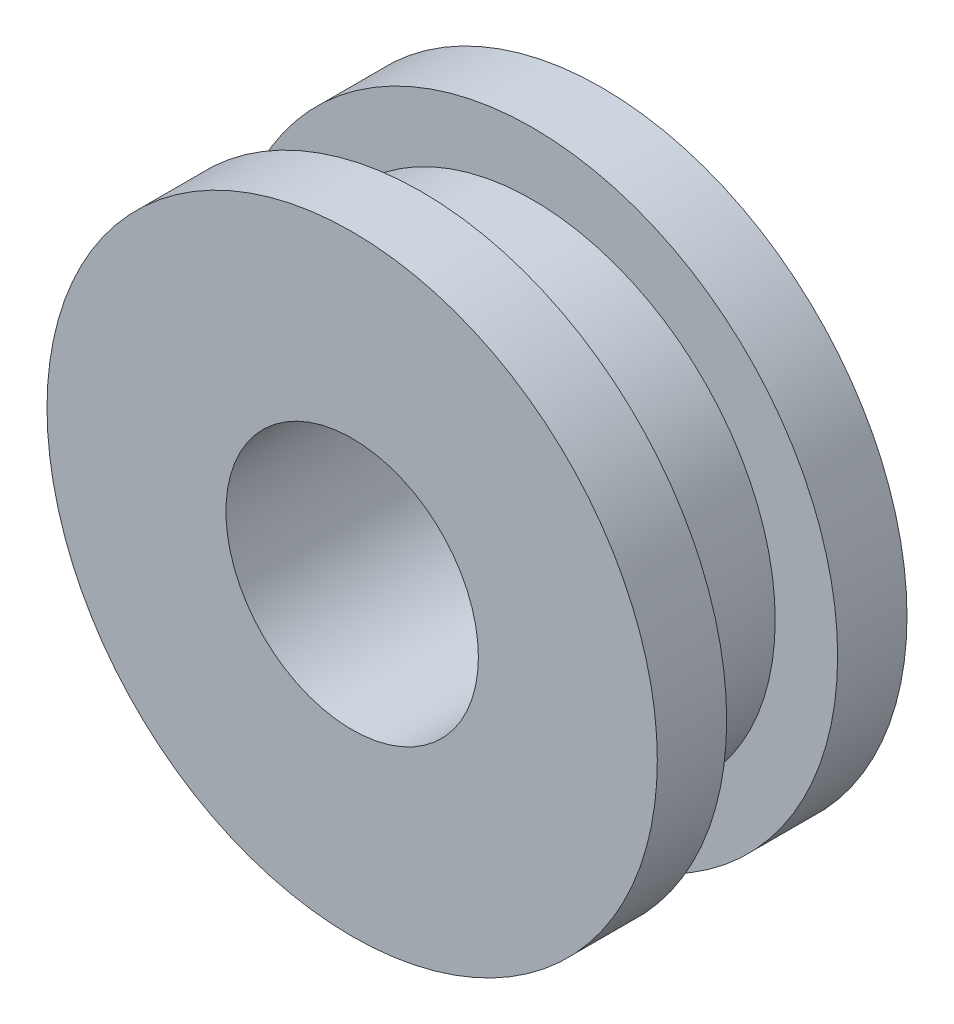
ISO-10303-21;
HEADER;
FILE_DESCRIPTION(('STEP AP214'),'2;1');
FILE_NAME('part.step','',(''),(''),'','','');
FILE_SCHEMA(('AUTOMOTIVE_DESIGN { 1 0 10303 214 1 1 1 1 }'));
ENDSEC;
DATA;
#1=APPLICATION_CONTEXT('core data for automotive mechanical design processes');
#2=APPLICATION_PROTOCOL_DEFINITION('international standard','automotive_design',2000,#1);
#3=PRODUCT_CONTEXT('',#1,'mechanical');
#4=PRODUCT('Part','Part','',(#3));
#5=PRODUCT_RELATED_PRODUCT_CATEGORY('part','',(#4));
#6=PRODUCT_DEFINITION_FORMATION('','',#4);
#7=PRODUCT_DEFINITION_CONTEXT('part definition',#1,'design');
#8=PRODUCT_DEFINITION('design','',#6,#7);
#9=PRODUCT_DEFINITION_SHAPE('','',#8);
#10=(LENGTH_UNIT() NAMED_UNIT(*) SI_UNIT(.MILLI.,.METRE.));
#11=(NAMED_UNIT(*) PLANE_ANGLE_UNIT() SI_UNIT($,.RADIAN.));
#12=(NAMED_UNIT(*) SI_UNIT($,.STERADIAN.) SOLID_ANGLE_UNIT());
#13=UNCERTAINTY_MEASURE_WITH_UNIT(LENGTH_MEASURE(1.E-05),#10,'distance_accuracy_value','');
#14=(GEOMETRIC_REPRESENTATION_CONTEXT(3) GLOBAL_UNCERTAINTY_ASSIGNED_CONTEXT((#13)) GLOBAL_UNIT_ASSIGNED_CONTEXT((#10,
#11,#12)) REPRESENTATION_CONTEXT('',''));
#15=CARTESIAN_POINT('',(0.,0.,0.));
#16=DIRECTION('',(0.,0.,1.));
#17=DIRECTION('',(1.,0.,0.));
#18=AXIS2_PLACEMENT_3D('',#15,#16,#17);
#19=CARTESIAN_POINT('',(0.,4.55,4.5));
#20=DIRECTION('',(0.,0.,-1.));
#21=DIRECTION('',(-1.,0.,0.));
#22=AXIS2_PLACEMENT_3D('',#19,#20,#21);
#23=PLANE('',#22);
#24=CARTESIAN_POINT('',(0.,0.,4.5));
#25=DIRECTION('',(0.,0.,1.));
#26=DIRECTION('',(1.,0.,0.));
#27=AXIS2_PLACEMENT_3D('',#24,#25,#26);
#28=CIRCLE('',#27,4.55);
#29=CARTESIAN_POINT('',(4.55,0.,4.5));
#30=VERTEX_POINT('',#29);
#31=EDGE_CURVE('E72',#30,#30,#28,.T.);
#32=ORIENTED_EDGE('',*,*,#31,.F.);
#33=EDGE_LOOP('',(#32));
#34=FACE_BOUND('',#33,.T.);
#35=CARTESIAN_POINT('',(0.,0.,4.5));
#36=DIRECTION('',(0.,0.,1.));
#37=DIRECTION('',(1.,0.,0.));
#38=AXIS2_PLACEMENT_3D('',#35,#36,#37);
#39=CIRCLE('',#38,11.);
#40=CARTESIAN_POINT('',(11.,0.,4.5));
#41=VERTEX_POINT('',#40);
#42=EDGE_CURVE('E10',#41,#41,#39,.T.);
#43=ORIENTED_EDGE('',*,*,#42,.T.);
#44=EDGE_LOOP('',(#43));
#45=FACE_BOUND('',#44,.T.);
#46=ADVANCED_FACE('F37',(#34,#45),#23,.F.);
#47=CARTESIAN_POINT('',(0.,0.,12.3294521552586));
#48=DIRECTION('',(0.,0.,1.));
#49=DIRECTION('',(1.,0.,0.));
#50=AXIS2_PLACEMENT_3D('',#47,#48,#49);
#51=CYLINDRICAL_SURFACE('',#50,11.);
#52=ORIENTED_EDGE('',*,*,#42,.F.);
#53=EDGE_LOOP('',(#52));
#54=FACE_BOUND('',#53,.T.);
#55=CARTESIAN_POINT('',(0.,0.,2.00000000000001));
#56=DIRECTION('',(0.,0.,1.));
#57=DIRECTION('',(1.,0.,0.));
#58=AXIS2_PLACEMENT_3D('',#55,#56,#57);
#59=CIRCLE('',#58,11.);
#60=CARTESIAN_POINT('',(11.,0.,2.00000000000001));
#61=VERTEX_POINT('',#60);
#62=EDGE_CURVE('E44',#61,#61,#59,.T.);
#63=ORIENTED_EDGE('',*,*,#62,.T.);
#64=EDGE_LOOP('',(#63));
#65=FACE_BOUND('',#64,.T.);
#66=ADVANCED_FACE('F80',(#54,#65),#51,.T.);
#67=CARTESIAN_POINT('',(0.,11.,2.00000000000001));
#68=DIRECTION('',(0.,0.,1.));
#69=DIRECTION('',(1.,0.,0.));
#70=AXIS2_PLACEMENT_3D('',#67,#68,#69);
#71=PLANE('',#70);
#72=ORIENTED_EDGE('',*,*,#62,.F.);
#73=EDGE_LOOP('',(#72));
#74=FACE_BOUND('',#73,.T.);
#75=CARTESIAN_POINT('',(0.,0.,2.00000000000001));
#76=DIRECTION('',(0.,0.,1.));
#77=DIRECTION('',(1.,0.,0.));
#78=AXIS2_PLACEMENT_3D('',#75,#76,#77);
#79=CIRCLE('',#78,8.75);
#80=CARTESIAN_POINT('',(8.75,0.,2.00000000000001));
#81=VERTEX_POINT('',#80);
#82=EDGE_CURVE('E49',#81,#81,#79,.T.);
#83=ORIENTED_EDGE('',*,*,#82,.T.);
#84=EDGE_LOOP('',(#83));
#85=FACE_BOUND('',#84,.T.);
#86=ADVANCED_FACE('F84',(#74,#85),#71,.F.);
#87=CARTESIAN_POINT('',(0.,0.,12.3294521552586));
#88=DIRECTION('',(0.,0.,1.));
#89=DIRECTION('',(1.,0.,0.));
#90=AXIS2_PLACEMENT_3D('',#87,#88,#89);
#91=CYLINDRICAL_SURFACE('',#90,8.75);
#92=ORIENTED_EDGE('',*,*,#82,.F.);
#93=EDGE_LOOP('',(#92));
#94=FACE_BOUND('',#93,.T.);
#95=CARTESIAN_POINT('',(0.,0.,-1.99999999999999));
#96=DIRECTION('',(0.,0.,1.));
#97=DIRECTION('',(1.,0.,0.));
#98=AXIS2_PLACEMENT_3D('',#95,#96,#97);
#99=CIRCLE('',#98,8.75);
#100=CARTESIAN_POINT('',(8.75,0.,-1.99999999999999));
#101=VERTEX_POINT('',#100);
#102=EDGE_CURVE('E54',#101,#101,#99,.T.);
#103=ORIENTED_EDGE('',*,*,#102,.T.);
#104=EDGE_LOOP('',(#103));
#105=FACE_BOUND('',#104,.T.);
#106=ADVANCED_FACE('F89',(#94,#105),#91,.T.);
#107=CARTESIAN_POINT('',(0.,8.75,-1.99999999999999));
#108=DIRECTION('',(0.,0.,-1.));
#109=DIRECTION('',(-1.,0.,0.));
#110=AXIS2_PLACEMENT_3D('',#107,#108,#109);
#111=PLANE('',#110);
#112=ORIENTED_EDGE('',*,*,#102,.F.);
#113=EDGE_LOOP('',(#112));
#114=FACE_BOUND('',#113,.T.);
#115=CARTESIAN_POINT('',(0.,0.,-1.99999999999999));
#116=DIRECTION('',(0.,0.,1.));
#117=DIRECTION('',(1.,0.,0.));
#118=AXIS2_PLACEMENT_3D('',#115,#116,#117);
#119=CIRCLE('',#118,11.);
#120=CARTESIAN_POINT('',(11.,0.,-1.99999999999999));
#121=VERTEX_POINT('',#120);
#122=EDGE_CURVE('E60',#121,#121,#119,.T.);
#123=ORIENTED_EDGE('',*,*,#122,.T.);
#124=EDGE_LOOP('',(#123));
#125=FACE_BOUND('',#124,.T.);
#126=ADVANCED_FACE('F95',(#114,#125),#111,.F.);
#127=CARTESIAN_POINT('',(0.,0.,12.3294521552586));
#128=DIRECTION('',(0.,0.,1.));
#129=DIRECTION('',(1.,0.,0.));
#130=AXIS2_PLACEMENT_3D('',#127,#128,#129);
#131=CYLINDRICAL_SURFACE('',#130,11.);
#132=ORIENTED_EDGE('',*,*,#122,.F.);
#133=EDGE_LOOP('',(#132));
#134=FACE_BOUND('',#133,.T.);
#135=CARTESIAN_POINT('',(0.,0.,-4.5));
#136=DIRECTION('',(0.,0.,1.));
#137=DIRECTION('',(1.,0.,0.));
#138=AXIS2_PLACEMENT_3D('',#135,#136,#137);
#139=CIRCLE('',#138,11.);
#140=CARTESIAN_POINT('',(11.,0.,-4.5));
#141=VERTEX_POINT('',#140);
#142=EDGE_CURVE('E64',#141,#141,#139,.T.);
#143=ORIENTED_EDGE('',*,*,#142,.T.);
#144=EDGE_LOOP('',(#143));
#145=FACE_BOUND('',#144,.T.);
#146=ADVANCED_FACE('F99',(#134,#145),#131,.T.);
#147=CARTESIAN_POINT('',(0.,11.,-4.5));
#148=DIRECTION('',(0.,0.,1.));
#149=DIRECTION('',(1.,0.,0.));
#150=AXIS2_PLACEMENT_3D('',#147,#148,#149);
#151=PLANE('',#150);
#152=ORIENTED_EDGE('',*,*,#142,.F.);
#153=EDGE_LOOP('',(#152));
#154=FACE_BOUND('',#153,.T.);
#155=CARTESIAN_POINT('',(0.,0.,-4.5));
#156=DIRECTION('',(0.,0.,1.));
#157=DIRECTION('',(1.,0.,0.));
#158=AXIS2_PLACEMENT_3D('',#155,#156,#157);
#159=CIRCLE('',#158,4.55);
#160=CARTESIAN_POINT('',(4.55,0.,-4.5));
#161=VERTEX_POINT('',#160);
#162=EDGE_CURVE('E68',#161,#161,#159,.T.);
#163=ORIENTED_EDGE('',*,*,#162,.T.);
#164=EDGE_LOOP('',(#163));
#165=FACE_BOUND('',#164,.T.);
#166=ADVANCED_FACE('F103',(#154,#165),#151,.F.);
#167=CARTESIAN_POINT('',(0.,0.,12.3294521552586));
#168=DIRECTION('',(0.,0.,1.));
#169=DIRECTION('',(1.,0.,0.));
#170=AXIS2_PLACEMENT_3D('',#167,#168,#169);
#171=CYLINDRICAL_SURFACE('',#170,4.55);
#172=ORIENTED_EDGE('',*,*,#162,.F.);
#173=EDGE_LOOP('',(#172));
#174=FACE_BOUND('',#173,.T.);
#175=ORIENTED_EDGE('',*,*,#31,.T.);
#176=EDGE_LOOP('',(#175));
#177=FACE_BOUND('',#176,.T.);
#178=ADVANCED_FACE('F77',(#174,#177),#171,.F.);
#179=CLOSED_SHELL('',(#46,#66,#86,#106,#126,#146,#166,#178));
#180=MANIFOLD_SOLID_BREP('B2',#179);
#181=ADVANCED_BREP_SHAPE_REPRESENTATION('',(#18,#180),#14);
#182=SHAPE_DEFINITION_REPRESENTATION(#9,#181);
ENDSEC;
END-ISO-10303-21;
